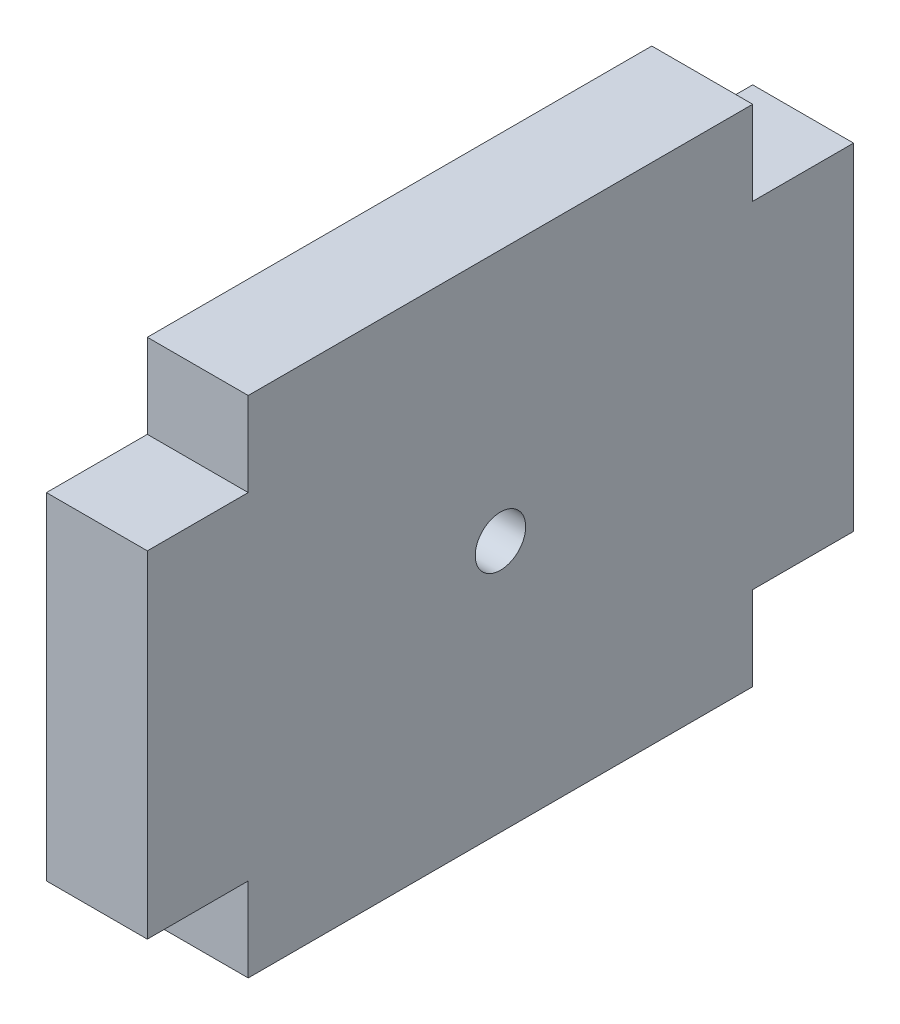
ISO-10303-21;
HEADER;
FILE_DESCRIPTION(('STEP AP214'),'2;1');
FILE_NAME('part.step','',(''),(''),'','','');
FILE_SCHEMA(('AUTOMOTIVE_DESIGN { 1 0 10303 214 1 1 1 1 }'));
ENDSEC;
DATA;
#1=APPLICATION_CONTEXT('core data for automotive mechanical design processes');
#2=APPLICATION_PROTOCOL_DEFINITION('international standard','automotive_design',2000,#1);
#3=PRODUCT_CONTEXT('',#1,'mechanical');
#4=PRODUCT('Part','Part','',(#3));
#5=PRODUCT_RELATED_PRODUCT_CATEGORY('part','',(#4));
#6=PRODUCT_DEFINITION_FORMATION('','',#4);
#7=PRODUCT_DEFINITION_CONTEXT('part definition',#1,'design');
#8=PRODUCT_DEFINITION('design','',#6,#7);
#9=PRODUCT_DEFINITION_SHAPE('','',#8);
#10=(LENGTH_UNIT() NAMED_UNIT(*) SI_UNIT(.MILLI.,.METRE.));
#11=(NAMED_UNIT(*) PLANE_ANGLE_UNIT() SI_UNIT($,.RADIAN.));
#12=(NAMED_UNIT(*) SI_UNIT($,.STERADIAN.) SOLID_ANGLE_UNIT());
#13=UNCERTAINTY_MEASURE_WITH_UNIT(LENGTH_MEASURE(1.E-05),#10,'distance_accuracy_value','');
#14=(GEOMETRIC_REPRESENTATION_CONTEXT(3) GLOBAL_UNCERTAINTY_ASSIGNED_CONTEXT((#13)) GLOBAL_UNIT_ASSIGNED_CONTEXT((#10,
#11,#12)) REPRESENTATION_CONTEXT('',''));
#15=CARTESIAN_POINT('',(0.,0.,0.));
#16=DIRECTION('',(0.,0.,1.));
#17=DIRECTION('',(1.,0.,0.));
#18=AXIS2_PLACEMENT_3D('',#15,#16,#17);
#19=CARTESIAN_POINT('',(3.,-5.00000000000001,0.));
#20=DIRECTION('',(0.,1.,0.));
#21=DIRECTION('',(0.,0.,1.));
#22=AXIS2_PLACEMENT_3D('',#19,#20,#21);
#23=PLANE('',#22);
#24=DIRECTION('',(0.,0.,-1.));
#25=VECTOR('',#24,1.);
#26=CARTESIAN_POINT('',(0.,-5.00000000000001,0.));
#27=LINE('',#26,#25);
#28=CARTESIAN_POINT('',(0.,-5.00000000000001,-7.5));
#29=VERTEX_POINT('',#28);
#30=CARTESIAN_POINT('',(0.,-5.00000000000001,-10.5));
#31=VERTEX_POINT('',#30);
#32=EDGE_CURVE('E194',#29,#31,#27,.T.);
#33=ORIENTED_EDGE('',*,*,#32,.T.);
#34=DIRECTION('',(-1.,0.,0.));
#35=VECTOR('',#34,1.);
#36=CARTESIAN_POINT('',(3.,-5.00000000000001,-10.5));
#37=LINE('',#36,#35);
#38=CARTESIAN_POINT('',(3.,-5.00000000000001,-10.5));
#39=VERTEX_POINT('',#38);
#40=EDGE_CURVE('E13',#39,#31,#37,.T.);
#41=ORIENTED_EDGE('',*,*,#40,.F.);
#42=DIRECTION('',(0.,0.,-1.));
#43=VECTOR('',#42,1.);
#44=CARTESIAN_POINT('',(3.,-5.00000000000001,0.));
#45=LINE('',#44,#43);
#46=CARTESIAN_POINT('',(3.,-5.00000000000001,-7.5));
#47=VERTEX_POINT('',#46);
#48=EDGE_CURVE('E187',#47,#39,#45,.T.);
#49=ORIENTED_EDGE('',*,*,#48,.F.);
#50=DIRECTION('',(-1.,0.,0.));
#51=VECTOR('',#50,1.);
#52=CARTESIAN_POINT('',(3.,-5.00000000000001,-7.5));
#53=LINE('',#52,#51);
#54=EDGE_CURVE('E228',#47,#29,#53,.T.);
#55=ORIENTED_EDGE('',*,*,#54,.T.);
#56=EDGE_LOOP('',(#33,#41,#49,#55));
#57=FACE_BOUND('',#56,.T.);
#58=ADVANCED_FACE('F51',(#57),#23,.F.);
#59=CARTESIAN_POINT('',(3.,0.,-10.5));
#60=DIRECTION('',(0.,0.,1.));
#61=DIRECTION('',(1.,0.,0.));
#62=AXIS2_PLACEMENT_3D('',#59,#60,#61);
#63=PLANE('',#62);
#64=DIRECTION('',(0.,1.,0.));
#65=VECTOR('',#64,1.);
#66=CARTESIAN_POINT('',(0.,0.,-10.5));
#67=LINE('',#66,#65);
#68=CARTESIAN_POINT('',(0.,4.99999999999999,-10.5));
#69=VERTEX_POINT('',#68);
#70=EDGE_CURVE('E198',#31,#69,#67,.T.);
#71=ORIENTED_EDGE('',*,*,#70,.T.);
#72=DIRECTION('',(-1.,0.,0.));
#73=VECTOR('',#72,1.);
#74=CARTESIAN_POINT('',(3.,4.99999999999999,-10.5));
#75=LINE('',#74,#73);
#76=CARTESIAN_POINT('',(3.,4.99999999999999,-10.5));
#77=VERTEX_POINT('',#76);
#78=EDGE_CURVE('E59',#77,#69,#75,.T.);
#79=ORIENTED_EDGE('',*,*,#78,.F.);
#80=DIRECTION('',(0.,1.,0.));
#81=VECTOR('',#80,1.);
#82=CARTESIAN_POINT('',(3.,0.,-10.5));
#83=LINE('',#82,#81);
#84=EDGE_CURVE('E121',#39,#77,#83,.T.);
#85=ORIENTED_EDGE('',*,*,#84,.F.);
#86=ORIENTED_EDGE('',*,*,#40,.T.);
#87=EDGE_LOOP('',(#71,#79,#85,#86));
#88=FACE_BOUND('',#87,.T.);
#89=ADVANCED_FACE('F247',(#88),#63,.F.);
#90=CARTESIAN_POINT('',(3.,4.99999999999999,0.));
#91=DIRECTION('',(0.,1.,0.));
#92=DIRECTION('',(0.,0.,1.));
#93=AXIS2_PLACEMENT_3D('',#90,#91,#92);
#94=PLANE('',#93);
#95=DIRECTION('',(0.,0.,-1.));
#96=VECTOR('',#95,1.);
#97=CARTESIAN_POINT('',(0.,4.99999999999999,0.));
#98=LINE('',#97,#96);
#99=CARTESIAN_POINT('',(0.,4.99999999999999,-7.5));
#100=VERTEX_POINT('',#99);
#101=EDGE_CURVE('E204',#100,#69,#98,.T.);
#102=ORIENTED_EDGE('',*,*,#101,.F.);
#103=DIRECTION('',(-1.,0.,0.));
#104=VECTOR('',#103,1.);
#105=CARTESIAN_POINT('',(3.,4.99999999999999,-7.5));
#106=LINE('',#105,#104);
#107=CARTESIAN_POINT('',(3.,4.99999999999999,-7.5));
#108=VERTEX_POINT('',#107);
#109=EDGE_CURVE('E242',#108,#100,#106,.T.);
#110=ORIENTED_EDGE('',*,*,#109,.F.);
#111=DIRECTION('',(0.,0.,-1.));
#112=VECTOR('',#111,1.);
#113=CARTESIAN_POINT('',(3.,4.99999999999999,0.));
#114=LINE('',#113,#112);
#115=EDGE_CURVE('E181',#108,#77,#114,.T.);
#116=ORIENTED_EDGE('',*,*,#115,.T.);
#117=ORIENTED_EDGE('',*,*,#78,.T.);
#118=EDGE_LOOP('',(#102,#110,#116,#117));
#119=FACE_BOUND('',#118,.T.);
#120=ADVANCED_FACE('F245',(#119),#94,.T.);
#121=CARTESIAN_POINT('',(3.,0.,-7.5));
#122=DIRECTION('',(0.,0.,1.));
#123=DIRECTION('',(0.,-1.,0.));
#124=AXIS2_PLACEMENT_3D('',#121,#122,#123);
#125=PLANE('',#124);
#126=DIRECTION('',(0.,1.,0.));
#127=VECTOR('',#126,1.);
#128=CARTESIAN_POINT('',(0.,0.,-7.5));
#129=LINE('',#128,#127);
#130=CARTESIAN_POINT('',(0.,7.5,-7.5));
#131=VERTEX_POINT('',#130);
#132=EDGE_CURVE('E209',#100,#131,#129,.T.);
#133=ORIENTED_EDGE('',*,*,#132,.T.);
#134=DIRECTION('',(-1.,0.,0.));
#135=VECTOR('',#134,1.);
#136=CARTESIAN_POINT('',(3.,7.5,-7.5));
#137=LINE('',#136,#135);
#138=CARTESIAN_POINT('',(3.,7.5,-7.5));
#139=VERTEX_POINT('',#138);
#140=EDGE_CURVE('E240',#139,#131,#137,.T.);
#141=ORIENTED_EDGE('',*,*,#140,.F.);
#142=DIRECTION('',(0.,1.,0.));
#143=VECTOR('',#142,1.);
#144=CARTESIAN_POINT('',(3.,0.,-7.5));
#145=LINE('',#144,#143);
#146=EDGE_CURVE('E178',#108,#139,#145,.T.);
#147=ORIENTED_EDGE('',*,*,#146,.F.);
#148=ORIENTED_EDGE('',*,*,#109,.T.);
#149=EDGE_LOOP('',(#133,#141,#147,#148));
#150=FACE_BOUND('',#149,.T.);
#151=ADVANCED_FACE('F254',(#150),#125,.F.);
#152=CARTESIAN_POINT('',(3.,7.5,0.));
#153=DIRECTION('',(0.,1.,0.));
#154=DIRECTION('',(0.,0.,1.));
#155=AXIS2_PLACEMENT_3D('',#152,#153,#154);
#156=PLANE('',#155);
#157=DIRECTION('',(0.,0.,-1.));
#158=VECTOR('',#157,1.);
#159=CARTESIAN_POINT('',(0.,7.5,0.));
#160=LINE('',#159,#158);
#161=CARTESIAN_POINT('',(0.,7.5,7.5));
#162=VERTEX_POINT('',#161);
#163=EDGE_CURVE('E212',#162,#131,#160,.T.);
#164=ORIENTED_EDGE('',*,*,#163,.F.);
#165=DIRECTION('',(-1.,0.,0.));
#166=VECTOR('',#165,1.);
#167=CARTESIAN_POINT('',(3.,7.5,7.5));
#168=LINE('',#167,#166);
#169=CARTESIAN_POINT('',(3.,7.5,7.5));
#170=VERTEX_POINT('',#169);
#171=EDGE_CURVE('E238',#170,#162,#168,.T.);
#172=ORIENTED_EDGE('',*,*,#171,.F.);
#173=DIRECTION('',(0.,0.,-1.));
#174=VECTOR('',#173,1.);
#175=CARTESIAN_POINT('',(3.,7.5,0.));
#176=LINE('',#175,#174);
#177=EDGE_CURVE('E174',#170,#139,#176,.T.);
#178=ORIENTED_EDGE('',*,*,#177,.T.);
#179=ORIENTED_EDGE('',*,*,#140,.T.);
#180=EDGE_LOOP('',(#164,#172,#178,#179));
#181=FACE_BOUND('',#180,.T.);
#182=ADVANCED_FACE('F266',(#181),#156,.T.);
#183=CARTESIAN_POINT('',(3.,0.,7.5));
#184=DIRECTION('',(0.,0.,1.));
#185=DIRECTION('',(1.,0.,0.));
#186=AXIS2_PLACEMENT_3D('',#183,#184,#185);
#187=PLANE('',#186);
#188=DIRECTION('',(0.,1.,0.));
#189=VECTOR('',#188,1.);
#190=CARTESIAN_POINT('',(0.,0.,7.5));
#191=LINE('',#190,#189);
#192=CARTESIAN_POINT('',(0.,4.99999999999999,7.5));
#193=VERTEX_POINT('',#192);
#194=EDGE_CURVE('E215',#193,#162,#191,.T.);
#195=ORIENTED_EDGE('',*,*,#194,.F.);
#196=DIRECTION('',(-1.,0.,0.));
#197=VECTOR('',#196,1.);
#198=CARTESIAN_POINT('',(3.,4.99999999999999,7.5));
#199=LINE('',#198,#197);
#200=CARTESIAN_POINT('',(3.,4.99999999999999,7.5));
#201=VERTEX_POINT('',#200);
#202=EDGE_CURVE('E236',#201,#193,#199,.T.);
#203=ORIENTED_EDGE('',*,*,#202,.F.);
#204=DIRECTION('',(0.,1.,0.));
#205=VECTOR('',#204,1.);
#206=CARTESIAN_POINT('',(3.,0.,7.5));
#207=LINE('',#206,#205);
#208=EDGE_CURVE('E167',#201,#170,#207,.T.);
#209=ORIENTED_EDGE('',*,*,#208,.T.);
#210=ORIENTED_EDGE('',*,*,#171,.T.);
#211=EDGE_LOOP('',(#195,#203,#209,#210));
#212=FACE_BOUND('',#211,.T.);
#213=ADVANCED_FACE('F269',(#212),#187,.T.);
#214=CARTESIAN_POINT('',(3.,4.99999999999999,0.));
#215=DIRECTION('',(0.,-1.,0.));
#216=DIRECTION('',(0.,0.,-1.));
#217=AXIS2_PLACEMENT_3D('',#214,#215,#216);
#218=PLANE('',#217);
#219=DIRECTION('',(0.,0.,1.));
#220=VECTOR('',#219,1.);
#221=CARTESIAN_POINT('',(0.,4.99999999999999,0.));
#222=LINE('',#221,#220);
#223=CARTESIAN_POINT('',(0.,4.99999999999999,10.5));
#224=VERTEX_POINT('',#223);
#225=EDGE_CURVE('E218',#193,#224,#222,.T.);
#226=ORIENTED_EDGE('',*,*,#225,.T.);
#227=DIRECTION('',(-1.,0.,0.));
#228=VECTOR('',#227,1.);
#229=CARTESIAN_POINT('',(3.,4.99999999999999,10.5));
#230=LINE('',#229,#228);
#231=CARTESIAN_POINT('',(3.,4.99999999999999,10.5));
#232=VERTEX_POINT('',#231);
#233=EDGE_CURVE('E234',#232,#224,#230,.T.);
#234=ORIENTED_EDGE('',*,*,#233,.F.);
#235=DIRECTION('',(0.,0.,1.));
#236=VECTOR('',#235,1.);
#237=CARTESIAN_POINT('',(3.,4.99999999999999,0.));
#238=LINE('',#237,#236);
#239=EDGE_CURVE('E173',#201,#232,#238,.T.);
#240=ORIENTED_EDGE('',*,*,#239,.F.);
#241=ORIENTED_EDGE('',*,*,#202,.T.);
#242=EDGE_LOOP('',(#226,#234,#240,#241));
#243=FACE_BOUND('',#242,.T.);
#244=ADVANCED_FACE('F270',(#243),#218,.F.);
#245=CARTESIAN_POINT('',(3.,0.,10.5));
#246=DIRECTION('',(0.,0.,1.));
#247=DIRECTION('',(0.,-1.,0.));
#248=AXIS2_PLACEMENT_3D('',#245,#246,#247);
#249=PLANE('',#248);
#250=DIRECTION('',(0.,1.,0.));
#251=VECTOR('',#250,1.);
#252=CARTESIAN_POINT('',(0.,0.,10.5));
#253=LINE('',#252,#251);
#254=CARTESIAN_POINT('',(0.,-5.00000000000001,10.5));
#255=VERTEX_POINT('',#254);
#256=EDGE_CURVE('E221',#255,#224,#253,.T.);
#257=ORIENTED_EDGE('',*,*,#256,.F.);
#258=DIRECTION('',(-1.,0.,0.));
#259=VECTOR('',#258,1.);
#260=CARTESIAN_POINT('',(3.,-5.00000000000001,10.5));
#261=LINE('',#260,#259);
#262=CARTESIAN_POINT('',(3.,-5.00000000000001,10.5));
#263=VERTEX_POINT('',#262);
#264=EDGE_CURVE('E232',#263,#255,#261,.T.);
#265=ORIENTED_EDGE('',*,*,#264,.F.);
#266=DIRECTION('',(0.,1.,0.));
#267=VECTOR('',#266,1.);
#268=CARTESIAN_POINT('',(3.,0.,10.5));
#269=LINE('',#268,#267);
#270=EDGE_CURVE('E168',#263,#232,#269,.T.);
#271=ORIENTED_EDGE('',*,*,#270,.T.);
#272=ORIENTED_EDGE('',*,*,#233,.T.);
#273=EDGE_LOOP('',(#257,#265,#271,#272));
#274=FACE_BOUND('',#273,.T.);
#275=ADVANCED_FACE('F273',(#274),#249,.T.);
#276=CARTESIAN_POINT('',(3.,-5.00000000000001,0.));
#277=DIRECTION('',(0.,-1.,0.));
#278=DIRECTION('',(0.,0.,-1.));
#279=AXIS2_PLACEMENT_3D('',#276,#277,#278);
#280=PLANE('',#279);
#281=DIRECTION('',(0.,0.,1.));
#282=VECTOR('',#281,1.);
#283=CARTESIAN_POINT('',(0.,-5.00000000000001,0.));
#284=LINE('',#283,#282);
#285=CARTESIAN_POINT('',(0.,-5.00000000000001,7.5));
#286=VERTEX_POINT('',#285);
#287=EDGE_CURVE('E224',#286,#255,#284,.T.);
#288=ORIENTED_EDGE('',*,*,#287,.F.);
#289=DIRECTION('',(-1.,0.,0.));
#290=VECTOR('',#289,1.);
#291=CARTESIAN_POINT('',(3.,-5.00000000000001,7.5));
#292=LINE('',#291,#290);
#293=CARTESIAN_POINT('',(3.,-5.00000000000001,7.5));
#294=VERTEX_POINT('',#293);
#295=EDGE_CURVE('E155',#294,#286,#292,.T.);
#296=ORIENTED_EDGE('',*,*,#295,.F.);
#297=DIRECTION('',(0.,0.,1.));
#298=VECTOR('',#297,1.);
#299=CARTESIAN_POINT('',(3.,-5.00000000000001,0.));
#300=LINE('',#299,#298);
#301=EDGE_CURVE('E165',#294,#263,#300,.T.);
#302=ORIENTED_EDGE('',*,*,#301,.T.);
#303=ORIENTED_EDGE('',*,*,#264,.T.);
#304=EDGE_LOOP('',(#288,#296,#302,#303));
#305=FACE_BOUND('',#304,.T.);
#306=ADVANCED_FACE('F277',(#305),#280,.T.);
#307=CARTESIAN_POINT('',(0.,-7.5,7.5));
#308=VERTEX_POINT('',#307);
#309=EDGE_CURVE('E154',#308,#286,#191,.T.);
#310=ORIENTED_EDGE('',*,*,#309,.F.);
#311=DIRECTION('',(-1.,0.,0.));
#312=VECTOR('',#311,1.);
#313=CARTESIAN_POINT('',(3.,-7.5,7.5));
#314=LINE('',#313,#312);
#315=CARTESIAN_POINT('',(3.,-7.5,7.5));
#316=VERTEX_POINT('',#315);
#317=EDGE_CURVE('E148',#316,#308,#314,.T.);
#318=ORIENTED_EDGE('',*,*,#317,.F.);
#319=EDGE_CURVE('E152',#316,#294,#207,.T.);
#320=ORIENTED_EDGE('',*,*,#319,.T.);
#321=ORIENTED_EDGE('',*,*,#295,.T.);
#322=EDGE_LOOP('',(#310,#318,#320,#321));
#323=FACE_BOUND('',#322,.T.);
#324=ADVANCED_FACE('F150',(#323),#187,.T.);
#325=CARTESIAN_POINT('',(3.,-7.5,0.));
#326=DIRECTION('',(0.,1.,0.));
#327=DIRECTION('',(0.,0.,1.));
#328=AXIS2_PLACEMENT_3D('',#325,#326,#327);
#329=PLANE('',#328);
#330=DIRECTION('',(0.,0.,-1.));
#331=VECTOR('',#330,1.);
#332=CARTESIAN_POINT('',(0.,-7.5,0.));
#333=LINE('',#332,#331);
#334=CARTESIAN_POINT('',(0.,-7.5,-7.5));
#335=VERTEX_POINT('',#334);
#336=EDGE_CURVE('E107',#308,#335,#333,.T.);
#337=ORIENTED_EDGE('',*,*,#336,.T.);
#338=DIRECTION('',(-1.,0.,0.));
#339=VECTOR('',#338,1.);
#340=CARTESIAN_POINT('',(3.,-7.5,-7.5));
#341=LINE('',#340,#339);
#342=CARTESIAN_POINT('',(3.,-7.5,-7.5));
#343=VERTEX_POINT('',#342);
#344=EDGE_CURVE('E156',#343,#335,#341,.T.);
#345=ORIENTED_EDGE('',*,*,#344,.F.);
#346=DIRECTION('',(0.,0.,-1.));
#347=VECTOR('',#346,1.);
#348=CARTESIAN_POINT('',(3.,-7.5,0.));
#349=LINE('',#348,#347);
#350=EDGE_CURVE('E158',#316,#343,#349,.T.);
#351=ORIENTED_EDGE('',*,*,#350,.F.);
#352=ORIENTED_EDGE('',*,*,#317,.T.);
#353=EDGE_LOOP('',(#337,#345,#351,#352));
#354=FACE_BOUND('',#353,.T.);
#355=ADVANCED_FACE('F159',(#354),#329,.F.);
#356=EDGE_CURVE('E113',#335,#29,#129,.T.);
#357=ORIENTED_EDGE('',*,*,#356,.T.);
#358=ORIENTED_EDGE('',*,*,#54,.F.);
#359=EDGE_CURVE('E67',#343,#47,#145,.T.);
#360=ORIENTED_EDGE('',*,*,#359,.F.);
#361=ORIENTED_EDGE('',*,*,#344,.T.);
#362=EDGE_LOOP('',(#357,#358,#360,#361));
#363=FACE_BOUND('',#362,.T.);
#364=ADVANCED_FACE('F286',(#363),#125,.F.);
#365=CARTESIAN_POINT('',(3.,0.,0.));
#366=DIRECTION('',(1.,0.,0.));
#367=DIRECTION('',(0.,0.,-1.));
#368=AXIS2_PLACEMENT_3D('',#365,#366,#367);
#369=PLANE('',#368);
#370=CARTESIAN_POINT('',(3.,0.,0.));
#371=DIRECTION('',(1.,0.,0.));
#372=DIRECTION('',(0.,0.,-1.));
#373=AXIS2_PLACEMENT_3D('',#370,#371,#372);
#374=CIRCLE('',#373,0.75);
#375=CARTESIAN_POINT('',(3.,0.,-0.75));
#376=VERTEX_POINT('',#375);
#377=EDGE_CURVE('E189',#376,#376,#374,.T.);
#378=ORIENTED_EDGE('',*,*,#377,.F.);
#379=EDGE_LOOP('',(#378));
#380=FACE_BOUND('',#379,.T.);
#381=ORIENTED_EDGE('',*,*,#48,.T.);
#382=ORIENTED_EDGE('',*,*,#84,.T.);
#383=ORIENTED_EDGE('',*,*,#115,.F.);
#384=ORIENTED_EDGE('',*,*,#146,.T.);
#385=ORIENTED_EDGE('',*,*,#177,.F.);
#386=ORIENTED_EDGE('',*,*,#208,.F.);
#387=ORIENTED_EDGE('',*,*,#239,.T.);
#388=ORIENTED_EDGE('',*,*,#270,.F.);
#389=ORIENTED_EDGE('',*,*,#301,.F.);
#390=ORIENTED_EDGE('',*,*,#319,.F.);
#391=ORIENTED_EDGE('',*,*,#350,.T.);
#392=ORIENTED_EDGE('',*,*,#359,.T.);
#393=EDGE_LOOP('',(#381,#382,#383,#384,#385,#386,#387,#388,#389,#390,#391,#392));
#394=FACE_BOUND('',#393,.T.);
#395=ADVANCED_FACE('F162',(#380,#394),#369,.T.);
#396=CARTESIAN_POINT('',(0.,0.,0.));
#397=DIRECTION('',(1.,0.,0.));
#398=DIRECTION('',(0.,0.,-1.));
#399=AXIS2_PLACEMENT_3D('',#396,#397,#398);
#400=PLANE('',#399);
#401=CARTESIAN_POINT('',(0.,0.,0.));
#402=DIRECTION('',(1.,0.,0.));
#403=DIRECTION('',(0.,0.,-1.));
#404=AXIS2_PLACEMENT_3D('',#401,#402,#403);
#405=CIRCLE('',#404,0.75);
#406=CARTESIAN_POINT('',(0.,0.,-0.75));
#407=VERTEX_POINT('',#406);
#408=EDGE_CURVE('E192',#407,#407,#405,.T.);
#409=ORIENTED_EDGE('',*,*,#408,.T.);
#410=EDGE_LOOP('',(#409));
#411=FACE_BOUND('',#410,.T.);
#412=ORIENTED_EDGE('',*,*,#32,.F.);
#413=ORIENTED_EDGE('',*,*,#356,.F.);
#414=ORIENTED_EDGE('',*,*,#336,.F.);
#415=ORIENTED_EDGE('',*,*,#309,.T.);
#416=ORIENTED_EDGE('',*,*,#287,.T.);
#417=ORIENTED_EDGE('',*,*,#256,.T.);
#418=ORIENTED_EDGE('',*,*,#225,.F.);
#419=ORIENTED_EDGE('',*,*,#194,.T.);
#420=ORIENTED_EDGE('',*,*,#163,.T.);
#421=ORIENTED_EDGE('',*,*,#132,.F.);
#422=ORIENTED_EDGE('',*,*,#101,.T.);
#423=ORIENTED_EDGE('',*,*,#70,.F.);
#424=EDGE_LOOP('',(#412,#413,#414,#415,#416,#417,#418,#419,#420,#421,#422,#423));
#425=FACE_BOUND('',#424,.T.);
#426=ADVANCED_FACE('F250',(#411,#425),#400,.F.);
#427=CARTESIAN_POINT('',(0.,0.,0.));
#428=DIRECTION('',(1.,0.,0.));
#429=DIRECTION('',(0.,0.,-1.));
#430=AXIS2_PLACEMENT_3D('',#427,#428,#429);
#431=CYLINDRICAL_SURFACE('',#430,0.75);
#432=ORIENTED_EDGE('',*,*,#408,.F.);
#433=EDGE_LOOP('',(#432));
#434=FACE_BOUND('',#433,.T.);
#435=ORIENTED_EDGE('',*,*,#377,.T.);
#436=EDGE_LOOP('',(#435));
#437=FACE_BOUND('',#436,.T.);
#438=ADVANCED_FACE('F291',(#434,#437),#431,.F.);
#439=CLOSED_SHELL('',(#58,#89,#120,#151,#182,#213,#244,#275,#306,#324,#355,#364,#395,#426,#438));
#440=MANIFOLD_SOLID_BREP('B2',#439);
#441=ADVANCED_BREP_SHAPE_REPRESENTATION('',(#18,#440),#14);
#442=SHAPE_DEFINITION_REPRESENTATION(#9,#441);
ENDSEC;
END-ISO-10303-21;
